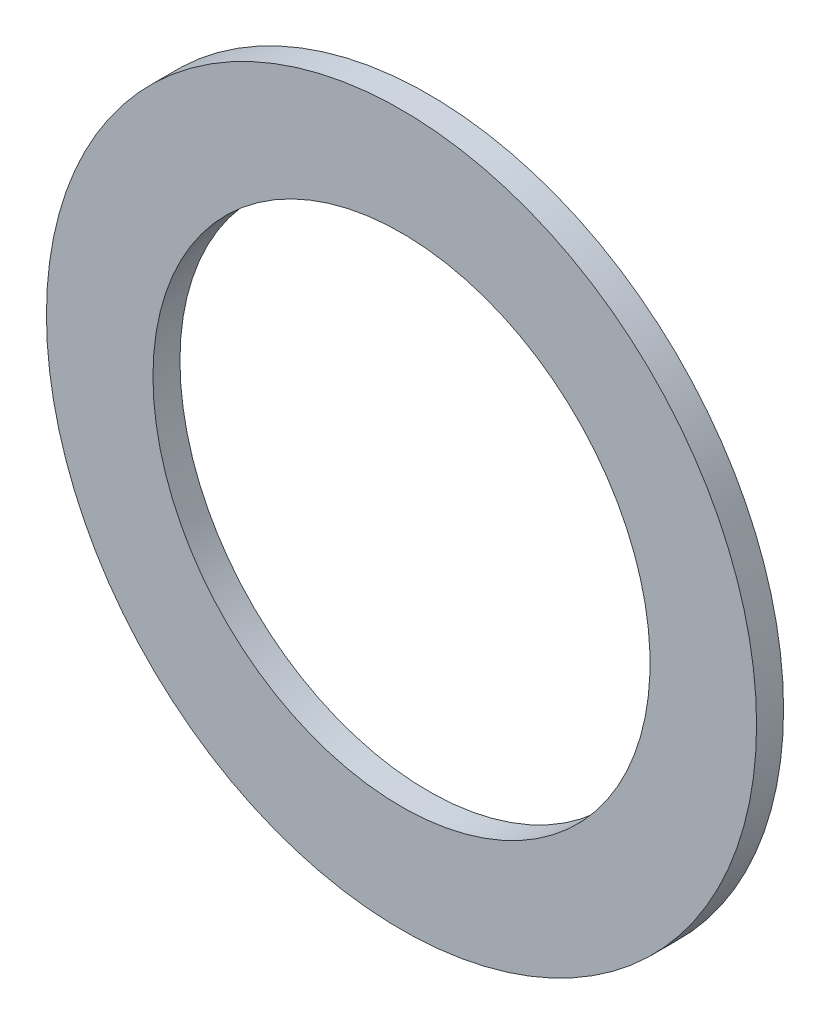
ISO-10303-21;
HEADER;
FILE_DESCRIPTION(('STEP AP214'),'2;1');
FILE_NAME('part.step','',(''),(''),'','','');
FILE_SCHEMA(('AUTOMOTIVE_DESIGN { 1 0 10303 214 1 1 1 1 }'));
ENDSEC;
DATA;
#1=APPLICATION_CONTEXT('core data for automotive mechanical design processes');
#2=APPLICATION_PROTOCOL_DEFINITION('international standard','automotive_design',2000,#1);
#3=PRODUCT_CONTEXT('',#1,'mechanical');
#4=PRODUCT('Part','Part','',(#3));
#5=PRODUCT_RELATED_PRODUCT_CATEGORY('part','',(#4));
#6=PRODUCT_DEFINITION_FORMATION('','',#4);
#7=PRODUCT_DEFINITION_CONTEXT('part definition',#1,'design');
#8=PRODUCT_DEFINITION('design','',#6,#7);
#9=PRODUCT_DEFINITION_SHAPE('','',#8);
#10=(LENGTH_UNIT() NAMED_UNIT(*) SI_UNIT(.MILLI.,.METRE.));
#11=(NAMED_UNIT(*) PLANE_ANGLE_UNIT() SI_UNIT($,.RADIAN.));
#12=(NAMED_UNIT(*) SI_UNIT($,.STERADIAN.) SOLID_ANGLE_UNIT());
#13=UNCERTAINTY_MEASURE_WITH_UNIT(LENGTH_MEASURE(1.E-05),#10,'distance_accuracy_value','');
#14=(GEOMETRIC_REPRESENTATION_CONTEXT(3) GLOBAL_UNCERTAINTY_ASSIGNED_CONTEXT((#13)) GLOBAL_UNIT_ASSIGNED_CONTEXT((#10,
#11,#12)) REPRESENTATION_CONTEXT('',''));
#15=CARTESIAN_POINT('',(0.,0.,0.));
#16=DIRECTION('',(0.,0.,1.));
#17=DIRECTION('',(1.,0.,0.));
#18=AXIS2_PLACEMENT_3D('',#15,#16,#17);
#19=CARTESIAN_POINT('',(0.,0.,0.950000000000006));
#20=DIRECTION('',(0.,0.,1.));
#21=DIRECTION('',(1.,0.,0.));
#22=AXIS2_PLACEMENT_3D('',#19,#20,#21);
#23=PLANE('',#22);
#24=CARTESIAN_POINT('',(0.,0.,0.950000000000006));
#25=DIRECTION('',(0.,0.,1.));
#26=DIRECTION('',(1.,0.,0.));
#27=AXIS2_PLACEMENT_3D('',#24,#25,#26);
#28=CIRCLE('',#27,12.5);
#29=CARTESIAN_POINT('',(-12.5,0.,0.950000000000006));
#30=VERTEX_POINT('',#29);
#31=EDGE_CURVE('E10',#30,#30,#28,.T.);
#32=ORIENTED_EDGE('',*,*,#31,.T.);
#33=EDGE_LOOP('',(#32));
#34=FACE_BOUND('',#33,.T.);
#35=CARTESIAN_POINT('',(0.,0.,0.950000000000006));
#36=DIRECTION('',(0.,0.,1.));
#37=DIRECTION('',(1.,0.,0.));
#38=AXIS2_PLACEMENT_3D('',#35,#36,#37);
#39=CIRCLE('',#38,8.75);
#40=CARTESIAN_POINT('',(-8.75,0.,0.950000000000006));
#41=VERTEX_POINT('',#40);
#42=EDGE_CURVE('E41',#41,#41,#39,.T.);
#43=ORIENTED_EDGE('',*,*,#42,.F.);
#44=EDGE_LOOP('',(#43));
#45=FACE_BOUND('',#44,.T.);
#46=ADVANCED_FACE('F30',(#34,#45),#23,.T.);
#47=CARTESIAN_POINT('',(0.,0.,0.));
#48=DIRECTION('',(0.,0.,1.));
#49=DIRECTION('',(1.,0.,0.));
#50=AXIS2_PLACEMENT_3D('',#47,#48,#49);
#51=PLANE('',#50);
#52=CARTESIAN_POINT('',(0.,0.,0.));
#53=DIRECTION('',(0.,0.,1.));
#54=DIRECTION('',(1.,0.,0.));
#55=AXIS2_PLACEMENT_3D('',#52,#53,#54);
#56=CIRCLE('',#55,12.5);
#57=CARTESIAN_POINT('',(-12.5,0.,0.));
#58=VERTEX_POINT('',#57);
#59=EDGE_CURVE('E34',#58,#58,#56,.T.);
#60=ORIENTED_EDGE('',*,*,#59,.F.);
#61=EDGE_LOOP('',(#60));
#62=FACE_BOUND('',#61,.T.);
#63=CARTESIAN_POINT('',(0.,0.,0.));
#64=DIRECTION('',(0.,0.,1.));
#65=DIRECTION('',(1.,0.,0.));
#66=AXIS2_PLACEMENT_3D('',#63,#64,#65);
#67=CIRCLE('',#66,8.75);
#68=CARTESIAN_POINT('',(-8.75,0.,0.));
#69=VERTEX_POINT('',#68);
#70=EDGE_CURVE('E43',#69,#69,#67,.T.);
#71=ORIENTED_EDGE('',*,*,#70,.T.);
#72=EDGE_LOOP('',(#71));
#73=FACE_BOUND('',#72,.T.);
#74=ADVANCED_FACE('F53',(#62,#73),#51,.F.);
#75=CARTESIAN_POINT('',(0.,0.,0.950000000000006));
#76=DIRECTION('',(0.,0.,-1.));
#77=DIRECTION('',(-1.,0.,0.));
#78=AXIS2_PLACEMENT_3D('',#75,#76,#77);
#79=CYLINDRICAL_SURFACE('',#78,12.5);
#80=CARTESIAN_POINT('',(-12.5,0.,0.950000000000006));
#81=CARTESIAN_POINT('',(-12.5,0.,0.940104166666673));
#82=CARTESIAN_POINT('',(-12.5,0.,0.93020833333334));
#83=CARTESIAN_POINT('',(-12.5,0.,0.910416666666673));
#84=CARTESIAN_POINT('',(-12.5,0.,0.900520833333339));
#85=CARTESIAN_POINT('',(-12.5,0.,0.880729166666673));
#86=CARTESIAN_POINT('',(-12.5,0.,0.870833333333339));
#87=CARTESIAN_POINT('',(-12.5,0.,0.851041666666672));
#88=CARTESIAN_POINT('',(-12.5,0.,0.841145833333339));
#89=CARTESIAN_POINT('',(-12.5,0.,0.821354166666672));
#90=CARTESIAN_POINT('',(-12.5,0.,0.811458333333339));
#91=CARTESIAN_POINT('',(-12.5,0.,0.791666666666672));
#92=CARTESIAN_POINT('',(-12.5,0.,0.781770833333339));
#93=CARTESIAN_POINT('',(-12.5,0.,0.761979166666672));
#94=CARTESIAN_POINT('',(-12.5,0.,0.752083333333338));
#95=CARTESIAN_POINT('',(-12.5,0.,0.732291666666672));
#96=CARTESIAN_POINT('',(-12.5,0.,0.722395833333338));
#97=CARTESIAN_POINT('',(-12.5,0.,0.702604166666671));
#98=CARTESIAN_POINT('',(-12.5,0.,0.692708333333338));
#99=CARTESIAN_POINT('',(-12.5,0.,0.672916666666671));
#100=CARTESIAN_POINT('',(-12.5,0.,0.663020833333338));
#101=CARTESIAN_POINT('',(-12.5,0.,0.643229166666671));
#102=CARTESIAN_POINT('',(-12.5,0.,0.633333333333338));
#103=CARTESIAN_POINT('',(-12.5,0.,0.613541666666671));
#104=CARTESIAN_POINT('',(-12.5,0.,0.603645833333337));
#105=CARTESIAN_POINT('',(-12.5,0.,0.583854166666671));
#106=CARTESIAN_POINT('',(-12.5,0.,0.573958333333337));
#107=CARTESIAN_POINT('',(-12.5,0.,0.55416666666667));
#108=CARTESIAN_POINT('',(-12.5,0.,0.544270833333337));
#109=CARTESIAN_POINT('',(-12.5,0.,0.52447916666667));
#110=CARTESIAN_POINT('',(-12.5,0.,0.514583333333337));
#111=CARTESIAN_POINT('',(-12.5,0.,0.49479166666667));
#112=CARTESIAN_POINT('',(-12.5,0.,0.484895833333337));
#113=CARTESIAN_POINT('',(-12.5,0.,0.46510416666667));
#114=CARTESIAN_POINT('',(-12.5,0.,0.455208333333336));
#115=CARTESIAN_POINT('',(-12.5,0.,0.43541666666667));
#116=CARTESIAN_POINT('',(-12.5,0.,0.425520833333336));
#117=CARTESIAN_POINT('',(-12.5,0.,0.405729166666669));
#118=CARTESIAN_POINT('',(-12.5,0.,0.395833333333336));
#119=CARTESIAN_POINT('',(-12.5,0.,0.376041666666669));
#120=CARTESIAN_POINT('',(-12.5,0.,0.366145833333336));
#121=CARTESIAN_POINT('',(-12.5,0.,0.346354166666669));
#122=CARTESIAN_POINT('',(-12.5,0.,0.336458333333335));
#123=CARTESIAN_POINT('',(-12.5,0.,0.316666666666669));
#124=CARTESIAN_POINT('',(-12.5,0.,0.306770833333335));
#125=CARTESIAN_POINT('',(-12.5,0.,0.286979166666669));
#126=CARTESIAN_POINT('',(-12.5,0.,0.277083333333335));
#127=CARTESIAN_POINT('',(-12.5,0.,0.257291666666668));
#128=CARTESIAN_POINT('',(-12.5,0.,0.247395833333335));
#129=CARTESIAN_POINT('',(-12.5,0.,0.227604166666668));
#130=CARTESIAN_POINT('',(-12.5,0.,0.217708333333335));
#131=CARTESIAN_POINT('',(-12.5,0.,0.197916666666668));
#132=CARTESIAN_POINT('',(-12.5,0.,0.188020833333334));
#133=CARTESIAN_POINT('',(-12.5,0.,0.168229166666668));
#134=CARTESIAN_POINT('',(-12.5,0.,0.158333333333334));
#135=CARTESIAN_POINT('',(-12.5,0.,0.138541666666667));
#136=CARTESIAN_POINT('',(-12.5,0.,0.128645833333334));
#137=CARTESIAN_POINT('',(-12.5,0.,0.108854166666667));
#138=CARTESIAN_POINT('',(-12.5,0.,0.0989583333333339));
#139=CARTESIAN_POINT('',(-12.5,0.,0.0791666666666671));
#140=CARTESIAN_POINT('',(-12.5,0.,0.0692708333333337));
#141=CARTESIAN_POINT('',(-12.5,0.,0.0494791666666669));
#142=CARTESIAN_POINT('',(-12.5,0.,0.0395833333333335));
#143=CARTESIAN_POINT('',(-12.5,0.,0.0197916666666667));
#144=CARTESIAN_POINT('',(-12.5,0.,0.00989583333333328));
#145=CARTESIAN_POINT('',(-12.5,0.,0.));
#146=B_SPLINE_CURVE_WITH_KNOTS('',3,(#80,#81,#82,#83,#84,#85,#86,#87,#88,#89,#90,#91,#92,#93,
#94,#95,#96,#97,#98,#99,#100,#101,#102,#103,#104,#105,#106,#107,#108,#109,#110,#111,#112,#113,
#114,#115,#116,#117,#118,#119,#120,#121,#122,#123,#124,#125,#126,#127,#128,#129,#130,#131,#132,
#133,#134,#135,#136,#137,#138,#139,#140,#141,#142,#143,#144,#145),.UNSPECIFIED.,.F.,.F.,(4,2,2,
2,2,2,2,2,2,2,2,2,2,2,2,2,2,2,2,2,2,2,2,2,2,2,2,2,2,2,2,2,4),(0.,0.0296875000000001,
0.0593750000000003,0.0890625000000005,0.118750000000001,0.148437500000001,0.178125000000001,
0.207812500000001,0.237500000000001,0.267187500000002,0.296875000000002,0.326562500000002,
0.356250000000002,0.385937500000002,0.415625000000003,0.445312500000003,0.475000000000003,
0.504687500000003,0.534375000000004,0.564062500000004,0.593750000000004,0.623437500000004,
0.653125000000004,0.682812500000005,0.712500000000005,0.742187500000005,0.771875000000005,
0.801562500000005,0.831250000000006,0.860937500000006,0.890625000000006,0.920312500000006,
0.950000000000006),.UNSPECIFIED.);
#147=EDGE_CURVE('BSEAM32',#30,#58,#146,.T.);
#148=ORIENTED_EDGE('',*,*,#31,.F.);
#149=ORIENTED_EDGE('',*,*,#59,.T.);
#150=ORIENTED_EDGE('',*,*,#147,.T.);
#151=ORIENTED_EDGE('',*,*,#147,.F.);
#152=EDGE_LOOP('',(#148,#150,#149,#151));
#153=FACE_BOUND('',#152,.T.);
#154=ADVANCED_FACE('F32',(#153),#79,.T.);
#155=CARTESIAN_POINT('',(0.,0.,0.950000000000006));
#156=DIRECTION('',(0.,0.,-1.));
#157=DIRECTION('',(-1.,0.,0.));
#158=AXIS2_PLACEMENT_3D('',#155,#156,#157);
#159=CYLINDRICAL_SURFACE('',#158,8.75);
#160=CARTESIAN_POINT('',(-8.75,0.,0.950000000000006));
#161=CARTESIAN_POINT('',(-8.75,0.,0.940104166666673));
#162=CARTESIAN_POINT('',(-8.75,0.,0.93020833333334));
#163=CARTESIAN_POINT('',(-8.75,0.,0.910416666666673));
#164=CARTESIAN_POINT('',(-8.75,0.,0.900520833333339));
#165=CARTESIAN_POINT('',(-8.75,0.,0.880729166666673));
#166=CARTESIAN_POINT('',(-8.75,0.,0.870833333333339));
#167=CARTESIAN_POINT('',(-8.75,0.,0.851041666666672));
#168=CARTESIAN_POINT('',(-8.75,0.,0.841145833333339));
#169=CARTESIAN_POINT('',(-8.75,0.,0.821354166666672));
#170=CARTESIAN_POINT('',(-8.75,0.,0.811458333333339));
#171=CARTESIAN_POINT('',(-8.75,0.,0.791666666666672));
#172=CARTESIAN_POINT('',(-8.75,0.,0.781770833333339));
#173=CARTESIAN_POINT('',(-8.75,0.,0.761979166666672));
#174=CARTESIAN_POINT('',(-8.75,0.,0.752083333333338));
#175=CARTESIAN_POINT('',(-8.75,0.,0.732291666666672));
#176=CARTESIAN_POINT('',(-8.75,0.,0.722395833333338));
#177=CARTESIAN_POINT('',(-8.75,0.,0.702604166666671));
#178=CARTESIAN_POINT('',(-8.75,0.,0.692708333333338));
#179=CARTESIAN_POINT('',(-8.75,0.,0.672916666666671));
#180=CARTESIAN_POINT('',(-8.75,0.,0.663020833333338));
#181=CARTESIAN_POINT('',(-8.75,0.,0.643229166666671));
#182=CARTESIAN_POINT('',(-8.75,0.,0.633333333333338));
#183=CARTESIAN_POINT('',(-8.75,0.,0.613541666666671));
#184=CARTESIAN_POINT('',(-8.75,0.,0.603645833333337));
#185=CARTESIAN_POINT('',(-8.75,0.,0.583854166666671));
#186=CARTESIAN_POINT('',(-8.75,0.,0.573958333333337));
#187=CARTESIAN_POINT('',(-8.75,0.,0.55416666666667));
#188=CARTESIAN_POINT('',(-8.75,0.,0.544270833333337));
#189=CARTESIAN_POINT('',(-8.75,0.,0.52447916666667));
#190=CARTESIAN_POINT('',(-8.75,0.,0.514583333333337));
#191=CARTESIAN_POINT('',(-8.75,0.,0.49479166666667));
#192=CARTESIAN_POINT('',(-8.75,0.,0.484895833333337));
#193=CARTESIAN_POINT('',(-8.75,0.,0.46510416666667));
#194=CARTESIAN_POINT('',(-8.75,0.,0.455208333333336));
#195=CARTESIAN_POINT('',(-8.75,0.,0.43541666666667));
#196=CARTESIAN_POINT('',(-8.75,0.,0.425520833333336));
#197=CARTESIAN_POINT('',(-8.75,0.,0.405729166666669));
#198=CARTESIAN_POINT('',(-8.75,0.,0.395833333333336));
#199=CARTESIAN_POINT('',(-8.75,0.,0.376041666666669));
#200=CARTESIAN_POINT('',(-8.75,0.,0.366145833333336));
#201=CARTESIAN_POINT('',(-8.75,0.,0.346354166666669));
#202=CARTESIAN_POINT('',(-8.75,0.,0.336458333333335));
#203=CARTESIAN_POINT('',(-8.75,0.,0.316666666666669));
#204=CARTESIAN_POINT('',(-8.75,0.,0.306770833333335));
#205=CARTESIAN_POINT('',(-8.75,0.,0.286979166666669));
#206=CARTESIAN_POINT('',(-8.75,0.,0.277083333333335));
#207=CARTESIAN_POINT('',(-8.75,0.,0.257291666666668));
#208=CARTESIAN_POINT('',(-8.75,0.,0.247395833333335));
#209=CARTESIAN_POINT('',(-8.75,0.,0.227604166666668));
#210=CARTESIAN_POINT('',(-8.75,0.,0.217708333333335));
#211=CARTESIAN_POINT('',(-8.75,0.,0.197916666666668));
#212=CARTESIAN_POINT('',(-8.75,0.,0.188020833333334));
#213=CARTESIAN_POINT('',(-8.75,0.,0.168229166666668));
#214=CARTESIAN_POINT('',(-8.75,0.,0.158333333333334));
#215=CARTESIAN_POINT('',(-8.75,0.,0.138541666666667));
#216=CARTESIAN_POINT('',(-8.75,0.,0.128645833333334));
#217=CARTESIAN_POINT('',(-8.75,0.,0.108854166666667));
#218=CARTESIAN_POINT('',(-8.75,0.,0.0989583333333339));
#219=CARTESIAN_POINT('',(-8.75,0.,0.0791666666666671));
#220=CARTESIAN_POINT('',(-8.75,0.,0.0692708333333337));
#221=CARTESIAN_POINT('',(-8.75,0.,0.0494791666666669));
#222=CARTESIAN_POINT('',(-8.75,0.,0.0395833333333335));
#223=CARTESIAN_POINT('',(-8.75,0.,0.0197916666666667));
#224=CARTESIAN_POINT('',(-8.75,0.,0.00989583333333328));
#225=CARTESIAN_POINT('',(-8.75,0.,0.));
#226=B_SPLINE_CURVE_WITH_KNOTS('',3,(#160,#161,#162,#163,#164,#165,#166,#167,#168,#169,#170,
#171,#172,#173,#174,#175,#176,#177,#178,#179,#180,#181,#182,#183,#184,#185,#186,#187,#188,#189,
#190,#191,#192,#193,#194,#195,#196,#197,#198,#199,#200,#201,#202,#203,#204,#205,#206,#207,#208,
#209,#210,#211,#212,#213,#214,#215,#216,#217,#218,#219,#220,#221,#222,#223,#224,#225),
.UNSPECIFIED.,.F.,.F.,(4,2,2,2,2,2,2,2,2,2,2,2,2,2,2,2,2,2,2,2,2,2,2,2,2,2,2,2,2,2,2,2,4),(0.,
0.0296875000000001,0.0593750000000003,0.0890625000000005,0.118750000000001,0.148437500000001,
0.178125000000001,0.207812500000001,0.237500000000001,0.267187500000002,0.296875000000002,
0.326562500000002,0.356250000000002,0.385937500000002,0.415625000000003,0.445312500000003,
0.475000000000003,0.504687500000003,0.534375000000004,0.564062500000004,0.593750000000004,
0.623437500000004,0.653125000000004,0.682812500000005,0.712500000000005,0.742187500000005,
0.771875000000005,0.801562500000005,0.831250000000006,0.860937500000006,0.890625000000006,
0.920312500000006,0.950000000000006),.UNSPECIFIED.);
#227=EDGE_CURVE('BSEAM49',#41,#69,#226,.T.);
#228=ORIENTED_EDGE('',*,*,#42,.T.);
#229=ORIENTED_EDGE('',*,*,#70,.F.);
#230=ORIENTED_EDGE('',*,*,#227,.T.);
#231=ORIENTED_EDGE('',*,*,#227,.F.);
#232=EDGE_LOOP('',(#228,#230,#229,#231));
#233=FACE_BOUND('',#232,.T.);
#234=ADVANCED_FACE('F49',(#233),#159,.F.);
#235=CLOSED_SHELL('',(#46,#74,#154,#234));
#236=MANIFOLD_SOLID_BREP('B2',#235);
#237=ADVANCED_BREP_SHAPE_REPRESENTATION('',(#18,#236),#14);
#238=SHAPE_DEFINITION_REPRESENTATION(#9,#237);
ENDSEC;
END-ISO-10303-21;
